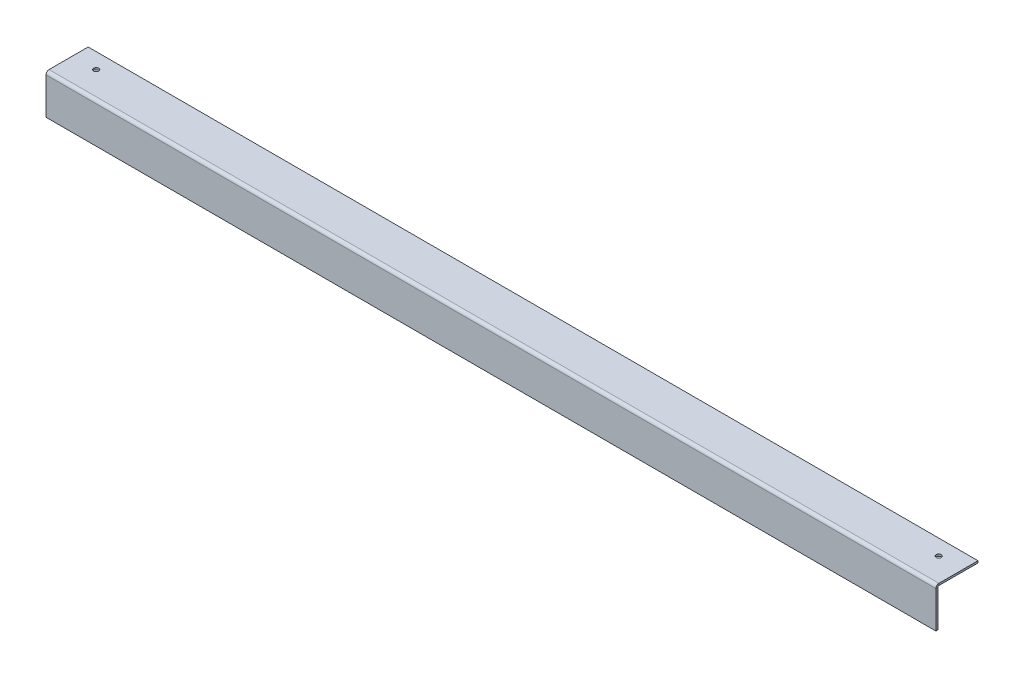
ISO-10303-21;
HEADER;
FILE_DESCRIPTION(('STEP AP214'),'2;1');
FILE_NAME('part.step','',(''),(''),'','','');
FILE_SCHEMA(('AUTOMOTIVE_DESIGN { 1 0 10303 214 1 1 1 1 }'));
ENDSEC;
DATA;
#1=APPLICATION_CONTEXT('core data for automotive mechanical design processes');
#2=APPLICATION_PROTOCOL_DEFINITION('international standard','automotive_design',2000,#1);
#3=PRODUCT_CONTEXT('',#1,'mechanical');
#4=PRODUCT('Part','Part','',(#3));
#5=PRODUCT_RELATED_PRODUCT_CATEGORY('part','',(#4));
#6=PRODUCT_DEFINITION_FORMATION('','',#4);
#7=PRODUCT_DEFINITION_CONTEXT('part definition',#1,'design');
#8=PRODUCT_DEFINITION('design','',#6,#7);
#9=PRODUCT_DEFINITION_SHAPE('','',#8);
#10=(LENGTH_UNIT() NAMED_UNIT(*) SI_UNIT(.MILLI.,.METRE.));
#11=(NAMED_UNIT(*) PLANE_ANGLE_UNIT() SI_UNIT($,.RADIAN.));
#12=(NAMED_UNIT(*) SI_UNIT($,.STERADIAN.) SOLID_ANGLE_UNIT());
#13=UNCERTAINTY_MEASURE_WITH_UNIT(LENGTH_MEASURE(1.E-05),#10,'distance_accuracy_value','');
#14=(GEOMETRIC_REPRESENTATION_CONTEXT(3) GLOBAL_UNCERTAINTY_ASSIGNED_CONTEXT((#13)) GLOBAL_UNIT_ASSIGNED_CONTEXT((#10,
#11,#12)) REPRESENTATION_CONTEXT('',''));
#15=CARTESIAN_POINT('',(0.,0.,0.));
#16=DIRECTION('',(0.,0.,1.));
#17=DIRECTION('',(1.,0.,0.));
#18=AXIS2_PLACEMENT_3D('',#15,#16,#17);
#19=CARTESIAN_POINT('',(-596.9,-2.58826,-26.9875));
#20=DIRECTION('',(-1.,0.,0.));
#21=DIRECTION('',(0.,0.,1.));
#22=AXIS2_PLACEMENT_3D('',#19,#20,#21);
#23=PLANE('',#22);
#24=DIRECTION('',(0.,0.,1.));
#25=VECTOR('',#24,1.);
#26=CARTESIAN_POINT('',(-596.9,-2.58826,-26.9875));
#27=LINE('',#26,#25);
#28=CARTESIAN_POINT('',(-596.9,-2.58826,-26.9875));
#29=VERTEX_POINT('',#28);
#30=CARTESIAN_POINT('',(-596.9,-2.58825999999997,25.4635));
#31=VERTEX_POINT('',#30);
#32=EDGE_CURVE('E111',#29,#31,#27,.T.);
#33=ORIENTED_EDGE('',*,*,#32,.T.);
#34=DIRECTION('',(0.,1.,0.));
#35=VECTOR('',#34,1.);
#36=CARTESIAN_POINT('',(-596.9,-2.58825999999997,25.4635));
#37=LINE('',#36,#35);
#38=CARTESIAN_POINT('',(-596.9,0.,25.4635));
#39=VERTEX_POINT('',#38);
#40=EDGE_CURVE('E98',#31,#39,#37,.T.);
#41=ORIENTED_EDGE('',*,*,#40,.T.);
#42=DIRECTION('',(0.,0.,1.));
#43=VECTOR('',#42,1.);
#44=CARTESIAN_POINT('',(-596.9,0.,-26.9875));
#45=LINE('',#44,#43);
#46=CARTESIAN_POINT('',(-596.9,0.,-26.9875));
#47=VERTEX_POINT('',#46);
#48=EDGE_CURVE('E96',#47,#39,#45,.T.);
#49=ORIENTED_EDGE('',*,*,#48,.F.);
#50=DIRECTION('',(0.,1.,0.));
#51=VECTOR('',#50,1.);
#52=CARTESIAN_POINT('',(-596.9,-2.58826,-26.9875));
#53=LINE('',#52,#51);
#54=EDGE_CURVE('E13',#29,#47,#53,.T.);
#55=ORIENTED_EDGE('',*,*,#54,.F.);
#56=EDGE_LOOP('',(#33,#41,#49,#55));
#57=FACE_BOUND('',#56,.T.);
#58=ADVANCED_FACE('F51',(#57),#23,.T.);
#59=CARTESIAN_POINT('',(0.,-2.58826,0.));
#60=DIRECTION('',(0.,1.,0.));
#61=DIRECTION('',(0.,0.,1.));
#62=AXIS2_PLACEMENT_3D('',#59,#60,#61);
#63=PLANE('',#62);
#64=CARTESIAN_POINT('',(565.15,-2.58826,-6.0325));
#65=DIRECTION('',(0.,1.,0.));
#66=DIRECTION('',(0.,0.,1.));
#67=AXIS2_PLACEMENT_3D('',#64,#65,#66);
#68=CIRCLE('',#67,3.3782);
#69=CARTESIAN_POINT('',(565.15,-2.58826,-2.6543));
#70=VERTEX_POINT('',#69);
#71=EDGE_CURVE('E173',#70,#70,#68,.T.);
#72=ORIENTED_EDGE('',*,*,#71,.T.);
#73=EDGE_LOOP('',(#72));
#74=FACE_BOUND('',#73,.T.);
#75=CARTESIAN_POINT('',(-565.15,-2.58826,-6.0325));
#76=DIRECTION('',(0.,1.,0.));
#77=DIRECTION('',(0.,0.,1.));
#78=AXIS2_PLACEMENT_3D('',#75,#76,#77);
#79=CIRCLE('',#78,3.3782);
#80=CARTESIAN_POINT('',(-565.15,-2.58826,-2.6543));
#81=VERTEX_POINT('',#80);
#82=EDGE_CURVE('E55',#81,#81,#79,.T.);
#83=ORIENTED_EDGE('',*,*,#82,.T.);
#84=EDGE_LOOP('',(#83));
#85=FACE_BOUND('',#84,.T.);
#86=DIRECTION('',(-1.,0.,0.));
#87=VECTOR('',#86,1.);
#88=CARTESIAN_POINT('',(-596.9,-2.58825999999997,25.4635));
#89=LINE('',#88,#87);
#90=CARTESIAN_POINT('',(596.9,-2.58825999999997,25.4635));
#91=VERTEX_POINT('',#90);
#92=EDGE_CURVE('E122',#31,#91,#89,.F.);
#93=ORIENTED_EDGE('',*,*,#92,.F.);
#94=ORIENTED_EDGE('',*,*,#32,.F.);
#95=DIRECTION('',(-1.,0.,0.));
#96=VECTOR('',#95,1.);
#97=CARTESIAN_POINT('',(-596.9,-2.58826,-26.9875));
#98=LINE('',#97,#96);
#99=CARTESIAN_POINT('',(596.9,-2.58826,-26.9875));
#100=VERTEX_POINT('',#99);
#101=EDGE_CURVE('E93',#100,#29,#98,.T.);
#102=ORIENTED_EDGE('',*,*,#101,.F.);
#103=DIRECTION('',(0.,0.,-1.));
#104=VECTOR('',#103,1.);
#105=CARTESIAN_POINT('',(596.9,-2.58826,-26.9875));
#106=LINE('',#105,#104);
#107=EDGE_CURVE('E101',#91,#100,#106,.T.);
#108=ORIENTED_EDGE('',*,*,#107,.F.);
#109=EDGE_LOOP('',(#93,#94,#102,#108));
#110=FACE_BOUND('',#109,.T.);
#111=ADVANCED_FACE('F185',(#74,#85,#110),#63,.F.);
#112=CARTESIAN_POINT('',(0.,0.,0.));
#113=DIRECTION('',(0.,1.,0.));
#114=DIRECTION('',(0.,0.,1.));
#115=AXIS2_PLACEMENT_3D('',#112,#113,#114);
#116=PLANE('',#115);
#117=CARTESIAN_POINT('',(565.15,0.,-6.0325));
#118=DIRECTION('',(0.,1.,0.));
#119=DIRECTION('',(0.,0.,1.));
#120=AXIS2_PLACEMENT_3D('',#117,#118,#119);
#121=CIRCLE('',#120,3.3782);
#122=CARTESIAN_POINT('',(565.15,0.,-2.6543));
#123=VERTEX_POINT('',#122);
#124=EDGE_CURVE('E176',#123,#123,#121,.T.);
#125=ORIENTED_EDGE('',*,*,#124,.F.);
#126=EDGE_LOOP('',(#125));
#127=FACE_BOUND('',#126,.T.);
#128=CARTESIAN_POINT('',(-565.15,0.,-6.0325));
#129=DIRECTION('',(0.,1.,0.));
#130=DIRECTION('',(0.,0.,1.));
#131=AXIS2_PLACEMENT_3D('',#128,#129,#130);
#132=CIRCLE('',#131,3.3782);
#133=CARTESIAN_POINT('',(-565.15,0.,-2.6543));
#134=VERTEX_POINT('',#133);
#135=EDGE_CURVE('E170',#134,#134,#132,.T.);
#136=ORIENTED_EDGE('',*,*,#135,.F.);
#137=EDGE_LOOP('',(#136));
#138=FACE_BOUND('',#137,.T.);
#139=ORIENTED_EDGE('',*,*,#48,.T.);
#140=DIRECTION('',(-1.,0.,0.));
#141=VECTOR('',#140,1.);
#142=CARTESIAN_POINT('',(-596.9,0.,25.4635));
#143=LINE('',#142,#141);
#144=CARTESIAN_POINT('',(596.9,0.,25.4635));
#145=VERTEX_POINT('',#144);
#146=EDGE_CURVE('E132',#39,#145,#143,.F.);
#147=ORIENTED_EDGE('',*,*,#146,.T.);
#148=DIRECTION('',(0.,0.,-1.));
#149=VECTOR('',#148,1.);
#150=CARTESIAN_POINT('',(596.9,0.,-26.9875));
#151=LINE('',#150,#149);
#152=CARTESIAN_POINT('',(596.9,0.,-26.9875));
#153=VERTEX_POINT('',#152);
#154=EDGE_CURVE('E105',#145,#153,#151,.T.);
#155=ORIENTED_EDGE('',*,*,#154,.T.);
#156=DIRECTION('',(-1.,0.,0.));
#157=VECTOR('',#156,1.);
#158=CARTESIAN_POINT('',(-596.9,0.,-26.9875));
#159=LINE('',#158,#157);
#160=EDGE_CURVE('E91',#153,#47,#159,.T.);
#161=ORIENTED_EDGE('',*,*,#160,.T.);
#162=EDGE_LOOP('',(#139,#147,#155,#161));
#163=FACE_BOUND('',#162,.T.);
#164=ADVANCED_FACE('F103',(#127,#138,#163),#116,.T.);
#165=CARTESIAN_POINT('',(596.9,-2.58826,-26.9875));
#166=DIRECTION('',(1.,0.,0.));
#167=DIRECTION('',(0.,0.,-1.));
#168=AXIS2_PLACEMENT_3D('',#165,#166,#167);
#169=PLANE('',#168);
#170=DIRECTION('',(0.,1.,0.));
#171=VECTOR('',#170,1.);
#172=CARTESIAN_POINT('',(596.9,-2.58825999999997,25.4635));
#173=LINE('',#172,#171);
#174=EDGE_CURVE('E108',#91,#145,#173,.T.);
#175=ORIENTED_EDGE('',*,*,#174,.F.);
#176=ORIENTED_EDGE('',*,*,#107,.T.);
#177=DIRECTION('',(0.,1.,0.));
#178=VECTOR('',#177,1.);
#179=CARTESIAN_POINT('',(596.9,-2.58826,-26.9875));
#180=LINE('',#179,#178);
#181=EDGE_CURVE('E60',#100,#153,#180,.T.);
#182=ORIENTED_EDGE('',*,*,#181,.T.);
#183=ORIENTED_EDGE('',*,*,#154,.F.);
#184=EDGE_LOOP('',(#175,#176,#182,#183));
#185=FACE_BOUND('',#184,.T.);
#186=ADVANCED_FACE('F53',(#185),#169,.T.);
#187=CARTESIAN_POINT('',(-596.9,-2.58826,-26.9875));
#188=DIRECTION('',(0.,0.,-1.));
#189=DIRECTION('',(-1.,0.,0.));
#190=AXIS2_PLACEMENT_3D('',#187,#188,#189);
#191=PLANE('',#190);
#192=ORIENTED_EDGE('',*,*,#160,.F.);
#193=ORIENTED_EDGE('',*,*,#181,.F.);
#194=ORIENTED_EDGE('',*,*,#101,.T.);
#195=ORIENTED_EDGE('',*,*,#54,.T.);
#196=EDGE_LOOP('',(#192,#193,#194,#195));
#197=FACE_BOUND('',#196,.T.);
#198=ADVANCED_FACE('F88',(#197),#191,.T.);
#199=CARTESIAN_POINT('',(596.9,-4.11225999999997,25.4635));
#200=DIRECTION('',(1.,0.,0.));
#201=DIRECTION('',(0.,0.,-1.));
#202=AXIS2_PLACEMENT_3D('',#199,#200,#201);
#203=PLANE('',#202);
#204=DIRECTION('',(0.,0.,1.));
#205=VECTOR('',#204,1.);
#206=CARTESIAN_POINT('',(596.9,-4.11225999999999,26.9875));
#207=LINE('',#206,#205);
#208=CARTESIAN_POINT('',(596.9,-4.11225999999996,26.9875));
#209=VERTEX_POINT('',#208);
#210=CARTESIAN_POINT('',(596.9,-4.11225999999995,29.57576));
#211=VERTEX_POINT('',#210);
#212=EDGE_CURVE('E162',#209,#211,#207,.T.);
#213=ORIENTED_EDGE('',*,*,#212,.F.);
#214=CARTESIAN_POINT('',(596.9,-4.11225999999997,25.4635));
#215=DIRECTION('',(-1.,0.,0.));
#216=DIRECTION('',(0.,0.,1.));
#217=AXIS2_PLACEMENT_3D('',#214,#215,#216);
#218=CIRCLE('',#217,1.524);
#219=EDGE_CURVE('E126',#91,#209,#218,.F.);
#220=ORIENTED_EDGE('',*,*,#219,.F.);
#221=ORIENTED_EDGE('',*,*,#174,.T.);
#222=CARTESIAN_POINT('',(596.9,-4.11225999999997,25.4635));
#223=DIRECTION('',(-1.,0.,0.));
#224=DIRECTION('',(0.,0.,1.));
#225=AXIS2_PLACEMENT_3D('',#222,#223,#224);
#226=CIRCLE('',#225,4.11226);
#227=EDGE_CURVE('E68',#145,#211,#226,.F.);
#228=ORIENTED_EDGE('',*,*,#227,.T.);
#229=EDGE_LOOP('',(#213,#220,#221,#228));
#230=FACE_BOUND('',#229,.T.);
#231=ADVANCED_FACE('F217',(#230),#203,.T.);
#232=CARTESIAN_POINT('',(-596.9,-4.11225999999997,25.4635));
#233=DIRECTION('',(1.,0.,0.));
#234=DIRECTION('',(0.,0.,-1.));
#235=AXIS2_PLACEMENT_3D('',#232,#233,#234);
#236=PLANE('',#235);
#237=CARTESIAN_POINT('',(-596.9,-4.11225999999997,25.4635));
#238=DIRECTION('',(-1.,0.,0.));
#239=DIRECTION('',(0.,0.,1.));
#240=AXIS2_PLACEMENT_3D('',#237,#238,#239);
#241=CIRCLE('',#240,1.524);
#242=CARTESIAN_POINT('',(-596.9,-4.11225999999996,26.9875));
#243=VERTEX_POINT('',#242);
#244=EDGE_CURVE('E119',#243,#31,#241,.T.);
#245=ORIENTED_EDGE('',*,*,#244,.F.);
#246=DIRECTION('',(0.,0.,1.));
#247=VECTOR('',#246,1.);
#248=CARTESIAN_POINT('',(-596.9,-4.11225999999994,26.9875));
#249=LINE('',#248,#247);
#250=CARTESIAN_POINT('',(-596.9,-4.11225999999997,29.57576));
#251=VERTEX_POINT('',#250);
#252=EDGE_CURVE('E161',#243,#251,#249,.T.);
#253=ORIENTED_EDGE('',*,*,#252,.T.);
#254=CARTESIAN_POINT('',(-596.9,-4.11225999999997,25.4635));
#255=DIRECTION('',(-1.,0.,0.));
#256=DIRECTION('',(0.,0.,1.));
#257=AXIS2_PLACEMENT_3D('',#254,#255,#256);
#258=CIRCLE('',#257,4.11226);
#259=EDGE_CURVE('E129',#251,#39,#258,.T.);
#260=ORIENTED_EDGE('',*,*,#259,.T.);
#261=ORIENTED_EDGE('',*,*,#40,.F.);
#262=EDGE_LOOP('',(#245,#253,#260,#261));
#263=FACE_BOUND('',#262,.T.);
#264=ADVANCED_FACE('F227',(#263),#236,.F.);
#265=CARTESIAN_POINT('',(-596.9,-4.11225999999997,25.4635));
#266=DIRECTION('',(-1.,0.,0.));
#267=DIRECTION('',(0.,0.,1.));
#268=AXIS2_PLACEMENT_3D('',#265,#266,#267);
#269=CYLINDRICAL_SURFACE('',#268,4.11226);
#270=ORIENTED_EDGE('',*,*,#146,.F.);
#271=ORIENTED_EDGE('',*,*,#259,.F.);
#272=DIRECTION('',(-1.,0.,0.));
#273=VECTOR('',#272,1.);
#274=CARTESIAN_POINT('',(0.,-4.11225999999997,29.57576));
#275=LINE('',#274,#273);
#276=EDGE_CURVE('E151',#211,#251,#275,.T.);
#277=ORIENTED_EDGE('',*,*,#276,.F.);
#278=ORIENTED_EDGE('',*,*,#227,.F.);
#279=EDGE_LOOP('',(#270,#271,#277,#278));
#280=FACE_BOUND('',#279,.T.);
#281=ADVANCED_FACE('F230',(#280),#269,.T.);
#282=CARTESIAN_POINT('',(-596.9,-4.11225999999997,25.4635));
#283=DIRECTION('',(-1.,0.,0.));
#284=DIRECTION('',(0.,0.,1.));
#285=AXIS2_PLACEMENT_3D('',#282,#283,#284);
#286=CYLINDRICAL_SURFACE('',#285,1.524);
#287=ORIENTED_EDGE('',*,*,#92,.T.);
#288=ORIENTED_EDGE('',*,*,#219,.T.);
#289=DIRECTION('',(-1.,0.,0.));
#290=VECTOR('',#289,1.);
#291=CARTESIAN_POINT('',(596.9,-4.11225999999999,26.9875));
#292=LINE('',#291,#290);
#293=EDGE_CURVE('E165',#209,#243,#292,.T.);
#294=ORIENTED_EDGE('',*,*,#293,.T.);
#295=ORIENTED_EDGE('',*,*,#244,.T.);
#296=EDGE_LOOP('',(#287,#288,#294,#295));
#297=FACE_BOUND('',#296,.T.);
#298=ADVANCED_FACE('F208',(#297),#286,.F.);
#299=CARTESIAN_POINT('',(-596.9,-2.58825999999999,29.57576));
#300=DIRECTION('',(-1.,0.,0.));
#301=DIRECTION('',(0.,0.,1.));
#302=AXIS2_PLACEMENT_3D('',#299,#300,#301);
#303=PLANE('',#302);
#304=DIRECTION('',(0.,1.,0.));
#305=VECTOR('',#304,1.);
#306=CARTESIAN_POINT('',(-596.9,-2.58825999999999,29.57576));
#307=LINE('',#306,#305);
#308=CARTESIAN_POINT('',(-596.9,-53.38826,29.5757600000002));
#309=VERTEX_POINT('',#308);
#310=EDGE_CURVE('E138',#309,#251,#307,.T.);
#311=ORIENTED_EDGE('',*,*,#310,.T.);
#312=ORIENTED_EDGE('',*,*,#252,.F.);
#313=DIRECTION('',(0.,1.,0.));
#314=VECTOR('',#313,1.);
#315=CARTESIAN_POINT('',(-596.9,-2.58826,26.9875));
#316=LINE('',#315,#314);
#317=CARTESIAN_POINT('',(-596.9,-53.38826,26.9875000000002));
#318=VERTEX_POINT('',#317);
#319=EDGE_CURVE('E141',#318,#243,#316,.T.);
#320=ORIENTED_EDGE('',*,*,#319,.F.);
#321=DIRECTION('',(0.,0.,-1.));
#322=VECTOR('',#321,1.);
#323=CARTESIAN_POINT('',(-596.9,-53.38826,29.5757600000002));
#324=LINE('',#323,#322);
#325=EDGE_CURVE('E123',#309,#318,#324,.T.);
#326=ORIENTED_EDGE('',*,*,#325,.F.);
#327=EDGE_LOOP('',(#311,#312,#320,#326));
#328=FACE_BOUND('',#327,.T.);
#329=ADVANCED_FACE('F236',(#328),#303,.T.);
#330=CARTESIAN_POINT('',(596.9,-53.38826,29.5757600000002));
#331=DIRECTION('',(1.,0.,0.));
#332=DIRECTION('',(0.,0.,-1.));
#333=AXIS2_PLACEMENT_3D('',#330,#331,#332);
#334=PLANE('',#333);
#335=DIRECTION('',(0.,-1.,0.));
#336=VECTOR('',#335,1.);
#337=CARTESIAN_POINT('',(596.9,-53.38826,26.9875000000002));
#338=LINE('',#337,#336);
#339=CARTESIAN_POINT('',(596.9,-53.38826,26.9875000000002));
#340=VERTEX_POINT('',#339);
#341=EDGE_CURVE('E148',#209,#340,#338,.T.);
#342=ORIENTED_EDGE('',*,*,#341,.F.);
#343=ORIENTED_EDGE('',*,*,#212,.T.);
#344=DIRECTION('',(0.,-1.,0.));
#345=VECTOR('',#344,1.);
#346=CARTESIAN_POINT('',(596.9,-53.38826,29.5757600000002));
#347=LINE('',#346,#345);
#348=CARTESIAN_POINT('',(596.9,-53.38826,29.5757600000002));
#349=VERTEX_POINT('',#348);
#350=EDGE_CURVE('E144',#211,#349,#347,.T.);
#351=ORIENTED_EDGE('',*,*,#350,.T.);
#352=DIRECTION('',(0.,0.,-1.));
#353=VECTOR('',#352,1.);
#354=CARTESIAN_POINT('',(596.9,-53.38826,29.5757600000002));
#355=LINE('',#354,#353);
#356=EDGE_CURVE('E135',#349,#340,#355,.T.);
#357=ORIENTED_EDGE('',*,*,#356,.T.);
#358=EDGE_LOOP('',(#342,#343,#351,#357));
#359=FACE_BOUND('',#358,.T.);
#360=ADVANCED_FACE('F239',(#359),#334,.T.);
#361=CARTESIAN_POINT('',(0.,1.03037189844567E-13,29.57576));
#362=DIRECTION('',(0.,0.,1.));
#363=DIRECTION('',(0.,-1.,0.));
#364=AXIS2_PLACEMENT_3D('',#361,#362,#363);
#365=PLANE('',#364);
#366=ORIENTED_EDGE('',*,*,#350,.F.);
#367=ORIENTED_EDGE('',*,*,#276,.T.);
#368=ORIENTED_EDGE('',*,*,#310,.F.);
#369=DIRECTION('',(-1.,0.,0.));
#370=VECTOR('',#369,1.);
#371=CARTESIAN_POINT('',(-596.9,-53.38826,29.5757600000002));
#372=LINE('',#371,#370);
#373=EDGE_CURVE('E154',#349,#309,#372,.T.);
#374=ORIENTED_EDGE('',*,*,#373,.F.);
#375=EDGE_LOOP('',(#366,#367,#368,#374));
#376=FACE_BOUND('',#375,.T.);
#377=ADVANCED_FACE('F242',(#376),#365,.T.);
#378=CARTESIAN_POINT('',(0.,0.,26.9875));
#379=DIRECTION('',(0.,0.,1.));
#380=DIRECTION('',(0.,-1.,0.));
#381=AXIS2_PLACEMENT_3D('',#378,#379,#380);
#382=PLANE('',#381);
#383=ORIENTED_EDGE('',*,*,#293,.F.);
#384=ORIENTED_EDGE('',*,*,#341,.T.);
#385=DIRECTION('',(-1.,0.,0.));
#386=VECTOR('',#385,1.);
#387=CARTESIAN_POINT('',(-596.9,-53.38826,26.9875000000002));
#388=LINE('',#387,#386);
#389=EDGE_CURVE('E145',#340,#318,#388,.T.);
#390=ORIENTED_EDGE('',*,*,#389,.T.);
#391=ORIENTED_EDGE('',*,*,#319,.T.);
#392=EDGE_LOOP('',(#383,#384,#390,#391));
#393=FACE_BOUND('',#392,.T.);
#394=ADVANCED_FACE('F246',(#393),#382,.F.);
#395=CARTESIAN_POINT('',(-596.9,-53.38826,29.5757600000002));
#396=DIRECTION('',(0.,-1.,0.));
#397=DIRECTION('',(0.,0.,-1.));
#398=AXIS2_PLACEMENT_3D('',#395,#396,#397);
#399=PLANE('',#398);
#400=ORIENTED_EDGE('',*,*,#389,.F.);
#401=ORIENTED_EDGE('',*,*,#356,.F.);
#402=ORIENTED_EDGE('',*,*,#373,.T.);
#403=ORIENTED_EDGE('',*,*,#325,.T.);
#404=EDGE_LOOP('',(#400,#401,#402,#403));
#405=FACE_BOUND('',#404,.T.);
#406=ADVANCED_FACE('F192',(#405),#399,.T.);
#407=CARTESIAN_POINT('',(-565.15,0.,-6.0325));
#408=DIRECTION('',(0.,1.,0.));
#409=DIRECTION('',(0.,0.,1.));
#410=AXIS2_PLACEMENT_3D('',#407,#408,#409);
#411=CYLINDRICAL_SURFACE('',#410,3.3782);
#412=ORIENTED_EDGE('',*,*,#135,.T.);
#413=EDGE_LOOP('',(#412));
#414=FACE_BOUND('',#413,.T.);
#415=ORIENTED_EDGE('',*,*,#82,.F.);
#416=EDGE_LOOP('',(#415));
#417=FACE_BOUND('',#416,.T.);
#418=ADVANCED_FACE('F189',(#414,#417),#411,.F.);
#419=CARTESIAN_POINT('',(565.15,0.,-6.0325));
#420=DIRECTION('',(0.,1.,0.));
#421=DIRECTION('',(0.,0.,1.));
#422=AXIS2_PLACEMENT_3D('',#419,#420,#421);
#423=CYLINDRICAL_SURFACE('',#422,3.3782);
#424=ORIENTED_EDGE('',*,*,#124,.T.);
#425=EDGE_LOOP('',(#424));
#426=FACE_BOUND('',#425,.T.);
#427=ORIENTED_EDGE('',*,*,#71,.F.);
#428=EDGE_LOOP('',(#427));
#429=FACE_BOUND('',#428,.T.);
#430=ADVANCED_FACE('F180',(#426,#429),#423,.F.);
#431=CLOSED_SHELL('',(#58,#111,#164,#186,#198,#231,#264,#281,#298,#329,#360,#377,#394,#406,#418,#430));
#432=MANIFOLD_SOLID_BREP('B2',#431);
#433=ADVANCED_BREP_SHAPE_REPRESENTATION('',(#18,#432),#14);
#434=SHAPE_DEFINITION_REPRESENTATION(#9,#433);
ENDSEC;
END-ISO-10303-21;
